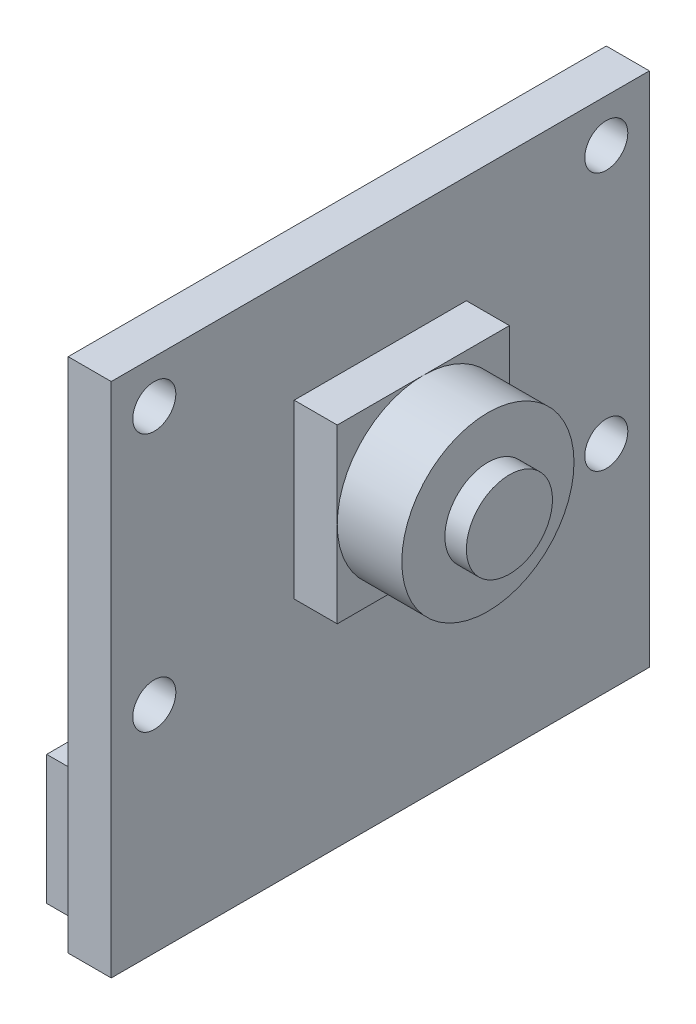
ISO-10303-21;
HEADER;
FILE_DESCRIPTION(('STEP AP214'),'2;1');
FILE_NAME('part.step','',(''),(''),'','','');
FILE_SCHEMA(('AUTOMOTIVE_DESIGN { 1 0 10303 214 1 1 1 1 }'));
ENDSEC;
DATA;
#1=APPLICATION_CONTEXT('core data for automotive mechanical design processes');
#2=APPLICATION_PROTOCOL_DEFINITION('international standard','automotive_design',2000,#1);
#3=PRODUCT_CONTEXT('',#1,'mechanical');
#4=PRODUCT('Part','Part','',(#3));
#5=PRODUCT_RELATED_PRODUCT_CATEGORY('part','',(#4));
#6=PRODUCT_DEFINITION_FORMATION('','',#4);
#7=PRODUCT_DEFINITION_CONTEXT('part definition',#1,'design');
#8=PRODUCT_DEFINITION('design','',#6,#7);
#9=PRODUCT_DEFINITION_SHAPE('','',#8);
#10=(LENGTH_UNIT() NAMED_UNIT(*) SI_UNIT(.MILLI.,.METRE.));
#11=(NAMED_UNIT(*) PLANE_ANGLE_UNIT() SI_UNIT($,.RADIAN.));
#12=(NAMED_UNIT(*) SI_UNIT($,.STERADIAN.) SOLID_ANGLE_UNIT());
#13=UNCERTAINTY_MEASURE_WITH_UNIT(LENGTH_MEASURE(1.E-05),#10,'distance_accuracy_value','');
#14=(GEOMETRIC_REPRESENTATION_CONTEXT(3) GLOBAL_UNCERTAINTY_ASSIGNED_CONTEXT((#13)) GLOBAL_UNIT_ASSIGNED_CONTEXT((#10,
#11,#12)) REPRESENTATION_CONTEXT('',''));
#15=CARTESIAN_POINT('',(0.,0.,0.));
#16=DIRECTION('',(0.,0.,1.));
#17=DIRECTION('',(1.,0.,0.));
#18=AXIS2_PLACEMENT_3D('',#15,#16,#17);
#19=CARTESIAN_POINT('',(4.,0.,0.));
#20=DIRECTION('',(1.,0.,0.));
#21=DIRECTION('',(0.,0.,-1.));
#22=AXIS2_PLACEMENT_3D('',#19,#20,#21);
#23=PLANE('',#22);
#24=CARTESIAN_POINT('',(4.,3.,0.));
#25=DIRECTION('',(1.,0.,0.));
#26=DIRECTION('',(0.,0.,-1.));
#27=AXIS2_PLACEMENT_3D('',#24,#25,#26);
#28=CIRCLE('',#27,4.);
#29=CARTESIAN_POINT('',(4.,3.,-4.));
#30=VERTEX_POINT('',#29);
#31=CARTESIAN_POINT('',(4.,7.,0.));
#32=VERTEX_POINT('',#31);
#33=EDGE_CURVE('E182',#30,#32,#28,.T.);
#34=ORIENTED_EDGE('',*,*,#33,.F.);
#35=DIRECTION('',(0.,1.,0.));
#36=VECTOR('',#35,1.);
#37=CARTESIAN_POINT('',(4.,7.,-4.));
#38=LINE('',#37,#36);
#39=CARTESIAN_POINT('',(4.,7.,-4.));
#40=VERTEX_POINT('',#39);
#41=EDGE_CURVE('E201',#30,#40,#38,.T.);
#42=ORIENTED_EDGE('',*,*,#41,.T.);
#43=DIRECTION('',(0.,0.,1.));
#44=VECTOR('',#43,1.);
#45=CARTESIAN_POINT('',(4.,7.,4.));
#46=LINE('',#45,#44);
#47=EDGE_CURVE('E202',#40,#32,#46,.T.);
#48=ORIENTED_EDGE('',*,*,#47,.T.);
#49=EDGE_LOOP('',(#34,#42,#48));
#50=FACE_BOUND('',#49,.T.);
#51=ADVANCED_FACE('F45',(#50),#23,.T.);
#52=CARTESIAN_POINT('',(4.,3.,4.));
#53=VERTEX_POINT('',#52);
#54=EDGE_CURVE('E190',#32,#53,#28,.T.);
#55=ORIENTED_EDGE('',*,*,#54,.F.);
#56=CARTESIAN_POINT('',(4.,7.,4.));
#57=VERTEX_POINT('',#56);
#58=EDGE_CURVE('E200',#32,#57,#46,.T.);
#59=ORIENTED_EDGE('',*,*,#58,.T.);
#60=DIRECTION('',(0.,-1.,0.));
#61=VECTOR('',#60,1.);
#62=CARTESIAN_POINT('',(4.,7.,4.));
#63=LINE('',#62,#61);
#64=EDGE_CURVE('E206',#57,#53,#63,.T.);
#65=ORIENTED_EDGE('',*,*,#64,.T.);
#66=EDGE_LOOP('',(#55,#59,#65));
#67=FACE_BOUND('',#66,.T.);
#68=ADVANCED_FACE('F303',(#67),#23,.T.);
#69=CARTESIAN_POINT('',(4.,-0.999999999999999,0.));
#70=VERTEX_POINT('',#69);
#71=EDGE_CURVE('E295',#53,#70,#28,.T.);
#72=ORIENTED_EDGE('',*,*,#71,.F.);
#73=CARTESIAN_POINT('',(4.,-0.999999999999999,4.));
#74=VERTEX_POINT('',#73);
#75=EDGE_CURVE('E205',#53,#74,#63,.T.);
#76=ORIENTED_EDGE('',*,*,#75,.T.);
#77=DIRECTION('',(0.,0.,-1.));
#78=VECTOR('',#77,1.);
#79=CARTESIAN_POINT('',(4.,-0.999999999999999,4.));
#80=LINE('',#79,#78);
#81=EDGE_CURVE('E210',#74,#70,#80,.T.);
#82=ORIENTED_EDGE('',*,*,#81,.T.);
#83=EDGE_LOOP('',(#72,#76,#82));
#84=FACE_BOUND('',#83,.T.);
#85=ADVANCED_FACE('F322',(#84),#23,.T.);
#86=CARTESIAN_POINT('',(2.,0.,0.));
#87=DIRECTION('',(-1.,0.,0.));
#88=DIRECTION('',(0.,0.,1.));
#89=AXIS2_PLACEMENT_3D('',#86,#87,#88);
#90=PLANE('',#89);
#91=CARTESIAN_POINT('',(2.,-2.,10.5));
#92=DIRECTION('',(1.,0.,0.));
#93=DIRECTION('',(0.,0.,1.));
#94=AXIS2_PLACEMENT_3D('',#91,#92,#93);
#95=CIRCLE('',#94,1.);
#96=CARTESIAN_POINT('',(2.,-2.,11.5));
#97=VERTEX_POINT('',#96);
#98=EDGE_CURVE('E237',#97,#97,#95,.T.);
#99=ORIENTED_EDGE('',*,*,#98,.F.);
#100=EDGE_LOOP('',(#99));
#101=FACE_BOUND('',#100,.T.);
#102=CARTESIAN_POINT('',(2.,10.,10.5));
#103=DIRECTION('',(1.,0.,0.));
#104=DIRECTION('',(0.,0.,1.));
#105=AXIS2_PLACEMENT_3D('',#102,#103,#104);
#106=CIRCLE('',#105,0.999999999999999);
#107=CARTESIAN_POINT('',(2.,10.,11.5));
#108=VERTEX_POINT('',#107);
#109=EDGE_CURVE('E243',#108,#108,#106,.T.);
#110=ORIENTED_EDGE('',*,*,#109,.F.);
#111=EDGE_LOOP('',(#110));
#112=FACE_BOUND('',#111,.T.);
#113=CARTESIAN_POINT('',(2.,-2.,-10.5));
#114=DIRECTION('',(1.,0.,0.));
#115=DIRECTION('',(0.,0.,-1.));
#116=AXIS2_PLACEMENT_3D('',#113,#114,#115);
#117=CIRCLE('',#116,1.);
#118=CARTESIAN_POINT('',(2.,-2.,-11.5));
#119=VERTEX_POINT('',#118);
#120=EDGE_CURVE('E249',#119,#119,#117,.T.);
#121=ORIENTED_EDGE('',*,*,#120,.F.);
#122=EDGE_LOOP('',(#121));
#123=FACE_BOUND('',#122,.T.);
#124=CARTESIAN_POINT('',(2.,10.,-10.5));
#125=DIRECTION('',(1.,0.,0.));
#126=DIRECTION('',(0.,0.,-1.));
#127=AXIS2_PLACEMENT_3D('',#124,#125,#126);
#128=CIRCLE('',#127,0.999999999999999);
#129=CARTESIAN_POINT('',(2.,10.,-11.5));
#130=VERTEX_POINT('',#129);
#131=EDGE_CURVE('E255',#130,#130,#128,.T.);
#132=ORIENTED_EDGE('',*,*,#131,.F.);
#133=EDGE_LOOP('',(#132));
#134=FACE_BOUND('',#133,.T.);
#135=DIRECTION('',(0.,1.,0.));
#136=VECTOR('',#135,1.);
#137=CARTESIAN_POINT('',(2.,-12.,-12.5));
#138=LINE('',#137,#136);
#139=CARTESIAN_POINT('',(2.,-12.,-12.5));
#140=VERTEX_POINT('',#139);
#141=CARTESIAN_POINT('',(2.,12.,-12.5));
#142=VERTEX_POINT('',#141);
#143=EDGE_CURVE('E261',#140,#142,#138,.T.);
#144=ORIENTED_EDGE('',*,*,#143,.T.);
#145=DIRECTION('',(0.,0.,1.));
#146=VECTOR('',#145,1.);
#147=CARTESIAN_POINT('',(2.,12.,12.5));
#148=LINE('',#147,#146);
#149=CARTESIAN_POINT('',(2.,12.,12.5));
#150=VERTEX_POINT('',#149);
#151=EDGE_CURVE('E264',#142,#150,#148,.T.);
#152=ORIENTED_EDGE('',*,*,#151,.T.);
#153=DIRECTION('',(0.,-1.,0.));
#154=VECTOR('',#153,1.);
#155=CARTESIAN_POINT('',(2.,-12.,12.5));
#156=LINE('',#155,#154);
#157=CARTESIAN_POINT('',(2.,-12.,12.5));
#158=VERTEX_POINT('',#157);
#159=EDGE_CURVE('E267',#150,#158,#156,.T.);
#160=ORIENTED_EDGE('',*,*,#159,.T.);
#161=DIRECTION('',(0.,0.,-1.));
#162=VECTOR('',#161,1.);
#163=CARTESIAN_POINT('',(2.,-12.,12.5));
#164=LINE('',#163,#162);
#165=EDGE_CURVE('E269',#158,#140,#164,.T.);
#166=ORIENTED_EDGE('',*,*,#165,.T.);
#167=EDGE_LOOP('',(#144,#152,#160,#166));
#168=FACE_BOUND('',#167,.T.);
#169=DIRECTION('',(0.,1.,0.));
#170=VECTOR('',#169,1.);
#171=CARTESIAN_POINT('',(2.,7.,-4.));
#172=LINE('',#171,#170);
#173=CARTESIAN_POINT('',(2.,-0.999999999999999,-4.));
#174=VERTEX_POINT('',#173);
#175=CARTESIAN_POINT('',(2.,7.,-4.));
#176=VERTEX_POINT('',#175);
#177=EDGE_CURVE('E194',#174,#176,#172,.T.);
#178=ORIENTED_EDGE('',*,*,#177,.F.);
#179=DIRECTION('',(0.,0.,-1.));
#180=VECTOR('',#179,1.);
#181=CARTESIAN_POINT('',(2.,-0.999999999999999,4.));
#182=LINE('',#181,#180);
#183=CARTESIAN_POINT('',(2.,-0.999999999999999,4.));
#184=VERTEX_POINT('',#183);
#185=EDGE_CURVE('E222',#184,#174,#182,.T.);
#186=ORIENTED_EDGE('',*,*,#185,.F.);
#187=DIRECTION('',(0.,-1.,0.));
#188=VECTOR('',#187,1.);
#189=CARTESIAN_POINT('',(2.,7.,4.));
#190=LINE('',#189,#188);
#191=CARTESIAN_POINT('',(2.,7.,4.));
#192=VERTEX_POINT('',#191);
#193=EDGE_CURVE('E219',#192,#184,#190,.T.);
#194=ORIENTED_EDGE('',*,*,#193,.F.);
#195=DIRECTION('',(0.,0.,1.));
#196=VECTOR('',#195,1.);
#197=CARTESIAN_POINT('',(2.,7.,4.));
#198=LINE('',#197,#196);
#199=EDGE_CURVE('E216',#176,#192,#198,.T.);
#200=ORIENTED_EDGE('',*,*,#199,.F.);
#201=EDGE_LOOP('',(#178,#186,#194,#200));
#202=FACE_BOUND('',#201,.T.);
#203=ADVANCED_FACE('F341',(#101,#112,#123,#134,#168,#202),#90,.F.);
#204=CARTESIAN_POINT('',(0.,0.,0.));
#205=DIRECTION('',(-1.,0.,0.));
#206=DIRECTION('',(0.,0.,1.));
#207=AXIS2_PLACEMENT_3D('',#204,#205,#206);
#208=PLANE('',#207);
#209=DIRECTION('',(0.,-1.,0.));
#210=VECTOR('',#209,1.);
#211=CARTESIAN_POINT('',(0.,-6.5,-10.5));
#212=LINE('',#211,#210);
#213=CARTESIAN_POINT('',(0.,-6.5,-10.5));
#214=VERTEX_POINT('',#213);
#215=CARTESIAN_POINT('',(0.,-12.,-10.5));
#216=VERTEX_POINT('',#215);
#217=EDGE_CURVE('E63',#214,#216,#212,.T.);
#218=ORIENTED_EDGE('',*,*,#217,.F.);
#219=DIRECTION('',(0.,0.,-1.));
#220=VECTOR('',#219,1.);
#221=CARTESIAN_POINT('',(0.,-6.5,-10.5));
#222=LINE('',#221,#220);
#223=CARTESIAN_POINT('',(0.,-6.5,10.5));
#224=VERTEX_POINT('',#223);
#225=EDGE_CURVE('E173',#224,#214,#222,.T.);
#226=ORIENTED_EDGE('',*,*,#225,.F.);
#227=DIRECTION('',(0.,1.,0.));
#228=VECTOR('',#227,1.);
#229=CARTESIAN_POINT('',(0.,-6.5,10.5));
#230=LINE('',#229,#228);
#231=CARTESIAN_POINT('',(0.,-12.,10.5));
#232=VERTEX_POINT('',#231);
#233=EDGE_CURVE('E11',#232,#224,#230,.T.);
#234=ORIENTED_EDGE('',*,*,#233,.F.);
#235=DIRECTION('',(0.,0.,-1.));
#236=VECTOR('',#235,1.);
#237=CARTESIAN_POINT('',(0.,-12.,12.5));
#238=LINE('',#237,#236);
#239=CARTESIAN_POINT('',(0.,-12.,12.5));
#240=VERTEX_POINT('',#239);
#241=EDGE_CURVE('E265',#240,#232,#238,.T.);
#242=ORIENTED_EDGE('',*,*,#241,.F.);
#243=DIRECTION('',(0.,-1.,0.));
#244=VECTOR('',#243,1.);
#245=CARTESIAN_POINT('',(0.,-12.,12.5));
#246=LINE('',#245,#244);
#247=CARTESIAN_POINT('',(0.,12.,12.5));
#248=VERTEX_POINT('',#247);
#249=EDGE_CURVE('E276',#248,#240,#246,.T.);
#250=ORIENTED_EDGE('',*,*,#249,.F.);
#251=DIRECTION('',(0.,0.,1.));
#252=VECTOR('',#251,1.);
#253=CARTESIAN_POINT('',(0.,12.,12.5));
#254=LINE('',#253,#252);
#255=CARTESIAN_POINT('',(0.,12.,-12.5));
#256=VERTEX_POINT('',#255);
#257=EDGE_CURVE('E274',#256,#248,#254,.T.);
#258=ORIENTED_EDGE('',*,*,#257,.F.);
#259=DIRECTION('',(0.,1.,0.));
#260=VECTOR('',#259,1.);
#261=CARTESIAN_POINT('',(0.,-12.,-12.5));
#262=LINE('',#261,#260);
#263=CARTESIAN_POINT('',(0.,-12.,-12.5));
#264=VERTEX_POINT('',#263);
#265=EDGE_CURVE('E258',#264,#256,#262,.T.);
#266=ORIENTED_EDGE('',*,*,#265,.F.);
#267=EDGE_CURVE('E68',#216,#264,#238,.T.);
#268=ORIENTED_EDGE('',*,*,#267,.F.);
#269=EDGE_LOOP('',(#218,#226,#234,#242,#250,#258,#266,#268));
#270=FACE_BOUND('',#269,.T.);
#271=CARTESIAN_POINT('',(0.,10.,10.5));
#272=DIRECTION('',(1.,0.,0.));
#273=DIRECTION('',(0.,0.,1.));
#274=AXIS2_PLACEMENT_3D('',#271,#272,#273);
#275=CIRCLE('',#274,0.999999999999999);
#276=CARTESIAN_POINT('',(0.,10.,11.5));
#277=VERTEX_POINT('',#276);
#278=EDGE_CURVE('E240',#277,#277,#275,.T.);
#279=ORIENTED_EDGE('',*,*,#278,.T.);
#280=EDGE_LOOP('',(#279));
#281=FACE_BOUND('',#280,.T.);
#282=CARTESIAN_POINT('',(0.,10.,-10.5));
#283=DIRECTION('',(1.,0.,0.));
#284=DIRECTION('',(0.,0.,-1.));
#285=AXIS2_PLACEMENT_3D('',#282,#283,#284);
#286=CIRCLE('',#285,0.999999999999999);
#287=CARTESIAN_POINT('',(0.,10.,-11.5));
#288=VERTEX_POINT('',#287);
#289=EDGE_CURVE('E252',#288,#288,#286,.T.);
#290=ORIENTED_EDGE('',*,*,#289,.T.);
#291=EDGE_LOOP('',(#290));
#292=FACE_BOUND('',#291,.T.);
#293=CARTESIAN_POINT('',(0.,-2.,-10.5));
#294=DIRECTION('',(1.,0.,0.));
#295=DIRECTION('',(0.,0.,-1.));
#296=AXIS2_PLACEMENT_3D('',#293,#294,#295);
#297=CIRCLE('',#296,1.);
#298=CARTESIAN_POINT('',(0.,-2.,-11.5));
#299=VERTEX_POINT('',#298);
#300=EDGE_CURVE('E246',#299,#299,#297,.T.);
#301=ORIENTED_EDGE('',*,*,#300,.T.);
#302=EDGE_LOOP('',(#301));
#303=FACE_BOUND('',#302,.T.);
#304=CARTESIAN_POINT('',(0.,-2.,10.5));
#305=DIRECTION('',(1.,0.,0.));
#306=DIRECTION('',(0.,0.,1.));
#307=AXIS2_PLACEMENT_3D('',#304,#305,#306);
#308=CIRCLE('',#307,1.);
#309=CARTESIAN_POINT('',(0.,-2.,11.5));
#310=VERTEX_POINT('',#309);
#311=EDGE_CURVE('E236',#310,#310,#308,.T.);
#312=ORIENTED_EDGE('',*,*,#311,.T.);
#313=EDGE_LOOP('',(#312));
#314=FACE_BOUND('',#313,.T.);
#315=ADVANCED_FACE('F346',(#270,#281,#292,#303,#314),#208,.T.);
#316=CARTESIAN_POINT('',(2.,-12.,-12.5));
#317=DIRECTION('',(0.,0.,1.));
#318=DIRECTION('',(1.,0.,0.));
#319=AXIS2_PLACEMENT_3D('',#316,#317,#318);
#320=PLANE('',#319);
#321=ORIENTED_EDGE('',*,*,#265,.T.);
#322=DIRECTION('',(-1.,0.,0.));
#323=VECTOR('',#322,1.);
#324=CARTESIAN_POINT('',(2.,12.,-12.5));
#325=LINE('',#324,#323);
#326=EDGE_CURVE('E49',#142,#256,#325,.T.);
#327=ORIENTED_EDGE('',*,*,#326,.F.);
#328=ORIENTED_EDGE('',*,*,#143,.F.);
#329=DIRECTION('',(-1.,0.,0.));
#330=VECTOR('',#329,1.);
#331=CARTESIAN_POINT('',(2.,-12.,-12.5));
#332=LINE('',#331,#330);
#333=EDGE_CURVE('E271',#140,#264,#332,.T.);
#334=ORIENTED_EDGE('',*,*,#333,.T.);
#335=EDGE_LOOP('',(#321,#327,#328,#334));
#336=FACE_BOUND('',#335,.T.);
#337=ADVANCED_FACE('F47',(#336),#320,.F.);
#338=CARTESIAN_POINT('',(2.,12.,12.5));
#339=DIRECTION('',(0.,-1.,0.));
#340=DIRECTION('',(0.,0.,-1.));
#341=AXIS2_PLACEMENT_3D('',#338,#339,#340);
#342=PLANE('',#341);
#343=ORIENTED_EDGE('',*,*,#257,.T.);
#344=DIRECTION('',(-1.,0.,0.));
#345=VECTOR('',#344,1.);
#346=CARTESIAN_POINT('',(2.,12.,12.5));
#347=LINE('',#346,#345);
#348=EDGE_CURVE('E285',#150,#248,#347,.T.);
#349=ORIENTED_EDGE('',*,*,#348,.F.);
#350=ORIENTED_EDGE('',*,*,#151,.F.);
#351=ORIENTED_EDGE('',*,*,#326,.T.);
#352=EDGE_LOOP('',(#343,#349,#350,#351));
#353=FACE_BOUND('',#352,.T.);
#354=ADVANCED_FACE('F456',(#353),#342,.F.);
#355=CARTESIAN_POINT('',(2.,-12.,12.5));
#356=DIRECTION('',(0.,0.,-1.));
#357=DIRECTION('',(-1.,0.,0.));
#358=AXIS2_PLACEMENT_3D('',#355,#356,#357);
#359=PLANE('',#358);
#360=ORIENTED_EDGE('',*,*,#249,.T.);
#361=DIRECTION('',(-1.,0.,0.));
#362=VECTOR('',#361,1.);
#363=CARTESIAN_POINT('',(2.,-12.,12.5));
#364=LINE('',#363,#362);
#365=EDGE_CURVE('E283',#158,#240,#364,.T.);
#366=ORIENTED_EDGE('',*,*,#365,.F.);
#367=ORIENTED_EDGE('',*,*,#159,.F.);
#368=ORIENTED_EDGE('',*,*,#348,.T.);
#369=EDGE_LOOP('',(#360,#366,#367,#368));
#370=FACE_BOUND('',#369,.T.);
#371=ADVANCED_FACE('F466',(#370),#359,.F.);
#372=CARTESIAN_POINT('',(2.,-12.,12.5));
#373=DIRECTION('',(0.,1.,0.));
#374=DIRECTION('',(0.,0.,1.));
#375=AXIS2_PLACEMENT_3D('',#372,#373,#374);
#376=PLANE('',#375);
#377=ORIENTED_EDGE('',*,*,#241,.T.);
#378=EDGE_CURVE('E280',#232,#216,#238,.T.);
#379=ORIENTED_EDGE('',*,*,#378,.T.);
#380=ORIENTED_EDGE('',*,*,#267,.T.);
#381=ORIENTED_EDGE('',*,*,#333,.F.);
#382=ORIENTED_EDGE('',*,*,#165,.F.);
#383=ORIENTED_EDGE('',*,*,#365,.T.);
#384=EDGE_LOOP('',(#377,#379,#380,#381,#382,#383));
#385=FACE_BOUND('',#384,.T.);
#386=ADVANCED_FACE('F475',(#385),#376,.F.);
#387=CARTESIAN_POINT('',(2.,10.,-10.5));
#388=DIRECTION('',(-1.,0.,0.));
#389=DIRECTION('',(0.,0.,1.));
#390=AXIS2_PLACEMENT_3D('',#387,#388,#389);
#391=CYLINDRICAL_SURFACE('',#390,0.999999999999999);
#392=ORIENTED_EDGE('',*,*,#131,.T.);
#393=EDGE_LOOP('',(#392));
#394=FACE_BOUND('',#393,.T.);
#395=ORIENTED_EDGE('',*,*,#289,.F.);
#396=EDGE_LOOP('',(#395));
#397=FACE_BOUND('',#396,.T.);
#398=ADVANCED_FACE('F483',(#394,#397),#391,.F.);
#399=CARTESIAN_POINT('',(2.,-2.,-10.5));
#400=DIRECTION('',(-1.,0.,0.));
#401=DIRECTION('',(0.,0.,1.));
#402=AXIS2_PLACEMENT_3D('',#399,#400,#401);
#403=CYLINDRICAL_SURFACE('',#402,1.);
#404=ORIENTED_EDGE('',*,*,#120,.T.);
#405=EDGE_LOOP('',(#404));
#406=FACE_BOUND('',#405,.T.);
#407=ORIENTED_EDGE('',*,*,#300,.F.);
#408=EDGE_LOOP('',(#407));
#409=FACE_BOUND('',#408,.T.);
#410=ADVANCED_FACE('F492',(#406,#409),#403,.F.);
#411=CARTESIAN_POINT('',(2.,10.,10.5));
#412=DIRECTION('',(-1.,0.,0.));
#413=DIRECTION('',(0.,0.,1.));
#414=AXIS2_PLACEMENT_3D('',#411,#412,#413);
#415=CYLINDRICAL_SURFACE('',#414,0.999999999999999);
#416=ORIENTED_EDGE('',*,*,#109,.T.);
#417=EDGE_LOOP('',(#416));
#418=FACE_BOUND('',#417,.T.);
#419=ORIENTED_EDGE('',*,*,#278,.F.);
#420=EDGE_LOOP('',(#419));
#421=FACE_BOUND('',#420,.T.);
#422=ADVANCED_FACE('F502',(#418,#421),#415,.F.);
#423=CARTESIAN_POINT('',(2.,-2.,10.5));
#424=DIRECTION('',(-1.,0.,0.));
#425=DIRECTION('',(0.,0.,1.));
#426=AXIS2_PLACEMENT_3D('',#423,#424,#425);
#427=CYLINDRICAL_SURFACE('',#426,1.);
#428=ORIENTED_EDGE('',*,*,#98,.T.);
#429=EDGE_LOOP('',(#428));
#430=FACE_BOUND('',#429,.T.);
#431=ORIENTED_EDGE('',*,*,#311,.F.);
#432=EDGE_LOOP('',(#431));
#433=FACE_BOUND('',#432,.T.);
#434=ADVANCED_FACE('F512',(#430,#433),#427,.F.);
#435=CARTESIAN_POINT('',(4.,7.,-4.));
#436=DIRECTION('',(0.,0.,1.));
#437=DIRECTION('',(0.,-1.,0.));
#438=AXIS2_PLACEMENT_3D('',#435,#436,#437);
#439=PLANE('',#438);
#440=ORIENTED_EDGE('',*,*,#177,.T.);
#441=DIRECTION('',(-1.,0.,0.));
#442=VECTOR('',#441,1.);
#443=CARTESIAN_POINT('',(4.,7.,-4.));
#444=LINE('',#443,#442);
#445=EDGE_CURVE('E233',#40,#176,#444,.T.);
#446=ORIENTED_EDGE('',*,*,#445,.F.);
#447=ORIENTED_EDGE('',*,*,#41,.F.);
#448=CARTESIAN_POINT('',(4.,-0.999999999999999,-4.));
#449=VERTEX_POINT('',#448);
#450=EDGE_CURVE('E198',#449,#30,#38,.T.);
#451=ORIENTED_EDGE('',*,*,#450,.F.);
#452=DIRECTION('',(-1.,0.,0.));
#453=VECTOR('',#452,1.);
#454=CARTESIAN_POINT('',(4.,-0.999999999999999,-4.));
#455=LINE('',#454,#453);
#456=EDGE_CURVE('E213',#449,#174,#455,.T.);
#457=ORIENTED_EDGE('',*,*,#456,.T.);
#458=EDGE_LOOP('',(#440,#446,#447,#451,#457));
#459=FACE_BOUND('',#458,.T.);
#460=ADVANCED_FACE('F314',(#459),#439,.F.);
#461=CARTESIAN_POINT('',(4.,7.,4.));
#462=DIRECTION('',(0.,-1.,0.));
#463=DIRECTION('',(0.,0.,-1.));
#464=AXIS2_PLACEMENT_3D('',#461,#462,#463);
#465=PLANE('',#464);
#466=ORIENTED_EDGE('',*,*,#199,.T.);
#467=DIRECTION('',(-1.,0.,0.));
#468=VECTOR('',#467,1.);
#469=CARTESIAN_POINT('',(4.,7.,4.));
#470=LINE('',#469,#468);
#471=EDGE_CURVE('E230',#57,#192,#470,.T.);
#472=ORIENTED_EDGE('',*,*,#471,.F.);
#473=ORIENTED_EDGE('',*,*,#58,.F.);
#474=ORIENTED_EDGE('',*,*,#47,.F.);
#475=ORIENTED_EDGE('',*,*,#445,.T.);
#476=EDGE_LOOP('',(#466,#472,#473,#474,#475));
#477=FACE_BOUND('',#476,.T.);
#478=ADVANCED_FACE('F308',(#477),#465,.F.);
#479=CARTESIAN_POINT('',(4.,7.,4.));
#480=DIRECTION('',(0.,0.,-1.));
#481=DIRECTION('',(0.,1.,0.));
#482=AXIS2_PLACEMENT_3D('',#479,#480,#481);
#483=PLANE('',#482);
#484=ORIENTED_EDGE('',*,*,#193,.T.);
#485=DIRECTION('',(-1.,0.,0.));
#486=VECTOR('',#485,1.);
#487=CARTESIAN_POINT('',(4.,-0.999999999999999,4.));
#488=LINE('',#487,#486);
#489=EDGE_CURVE('E227',#74,#184,#488,.T.);
#490=ORIENTED_EDGE('',*,*,#489,.F.);
#491=ORIENTED_EDGE('',*,*,#75,.F.);
#492=ORIENTED_EDGE('',*,*,#64,.F.);
#493=ORIENTED_EDGE('',*,*,#471,.T.);
#494=EDGE_LOOP('',(#484,#490,#491,#492,#493));
#495=FACE_BOUND('',#494,.T.);
#496=ADVANCED_FACE('F317',(#495),#483,.F.);
#497=CARTESIAN_POINT('',(4.,-0.999999999999999,4.));
#498=DIRECTION('',(0.,1.,0.));
#499=DIRECTION('',(0.,0.,1.));
#500=AXIS2_PLACEMENT_3D('',#497,#498,#499);
#501=PLANE('',#500);
#502=ORIENTED_EDGE('',*,*,#185,.T.);
#503=ORIENTED_EDGE('',*,*,#456,.F.);
#504=EDGE_CURVE('E209',#70,#449,#80,.T.);
#505=ORIENTED_EDGE('',*,*,#504,.F.);
#506=ORIENTED_EDGE('',*,*,#81,.F.);
#507=ORIENTED_EDGE('',*,*,#489,.T.);
#508=EDGE_LOOP('',(#502,#503,#505,#506,#507));
#509=FACE_BOUND('',#508,.T.);
#510=ADVANCED_FACE('F325',(#509),#501,.F.);
#511=EDGE_CURVE('E197',#70,#30,#28,.T.);
#512=ORIENTED_EDGE('',*,*,#511,.F.);
#513=ORIENTED_EDGE('',*,*,#504,.T.);
#514=ORIENTED_EDGE('',*,*,#450,.T.);
#515=EDGE_LOOP('',(#512,#513,#514));
#516=FACE_BOUND('',#515,.T.);
#517=ADVANCED_FACE('F328',(#516),#23,.T.);
#518=CARTESIAN_POINT('',(7.,3.,0.));
#519=DIRECTION('',(-1.,0.,0.));
#520=DIRECTION('',(0.,0.,1.));
#521=AXIS2_PLACEMENT_3D('',#518,#519,#520);
#522=CYLINDRICAL_SURFACE('',#521,4.);
#523=CARTESIAN_POINT('',(7.,3.,0.));
#524=DIRECTION('',(1.,0.,0.));
#525=DIRECTION('',(0.,0.,-1.));
#526=AXIS2_PLACEMENT_3D('',#523,#524,#525);
#527=CIRCLE('',#526,4.);
#528=CARTESIAN_POINT('',(7.,3.,-4.));
#529=VERTEX_POINT('',#528);
#530=EDGE_CURVE('E191',#529,#529,#527,.T.);
#531=ORIENTED_EDGE('',*,*,#530,.F.);
#532=EDGE_LOOP('',(#531));
#533=FACE_BOUND('',#532,.T.);
#534=ORIENTED_EDGE('',*,*,#33,.T.);
#535=ORIENTED_EDGE('',*,*,#54,.T.);
#536=ORIENTED_EDGE('',*,*,#71,.T.);
#537=ORIENTED_EDGE('',*,*,#511,.T.);
#538=EDGE_LOOP('',(#534,#535,#536,#537));
#539=FACE_BOUND('',#538,.T.);
#540=ADVANCED_FACE('F299',(#533,#539),#522,.T.);
#541=CARTESIAN_POINT('',(7.,3.,0.));
#542=DIRECTION('',(1.,0.,0.));
#543=DIRECTION('',(0.,0.,-1.));
#544=AXIS2_PLACEMENT_3D('',#541,#542,#543);
#545=PLANE('',#544);
#546=CARTESIAN_POINT('',(7.,3.,0.));
#547=DIRECTION('',(1.,0.,0.));
#548=DIRECTION('',(0.,0.,-1.));
#549=AXIS2_PLACEMENT_3D('',#546,#547,#548);
#550=CIRCLE('',#549,2.);
#551=CARTESIAN_POINT('',(7.,3.,-2.));
#552=VERTEX_POINT('',#551);
#553=EDGE_CURVE('E54',#552,#552,#550,.T.);
#554=ORIENTED_EDGE('',*,*,#553,.F.);
#555=EDGE_LOOP('',(#554));
#556=FACE_BOUND('',#555,.T.);
#557=ORIENTED_EDGE('',*,*,#530,.T.);
#558=EDGE_LOOP('',(#557));
#559=FACE_BOUND('',#558,.T.);
#560=ADVANCED_FACE('F335',(#556,#559),#545,.T.);
#561=CARTESIAN_POINT('',(8.,3.,0.));
#562=DIRECTION('',(-1.,0.,0.));
#563=DIRECTION('',(0.,0.,1.));
#564=AXIS2_PLACEMENT_3D('',#561,#562,#563);
#565=CYLINDRICAL_SURFACE('',#564,2.);
#566=CARTESIAN_POINT('',(8.,3.,0.));
#567=DIRECTION('',(1.,0.,0.));
#568=DIRECTION('',(0.,0.,-1.));
#569=AXIS2_PLACEMENT_3D('',#566,#567,#568);
#570=CIRCLE('',#569,2.);
#571=CARTESIAN_POINT('',(8.,3.,-2.));
#572=VERTEX_POINT('',#571);
#573=EDGE_CURVE('E179',#572,#572,#570,.T.);
#574=ORIENTED_EDGE('',*,*,#573,.F.);
#575=EDGE_LOOP('',(#574));
#576=FACE_BOUND('',#575,.T.);
#577=ORIENTED_EDGE('',*,*,#553,.T.);
#578=EDGE_LOOP('',(#577));
#579=FACE_BOUND('',#578,.T.);
#580=ADVANCED_FACE('F397',(#576,#579),#565,.T.);
#581=CARTESIAN_POINT('',(8.,3.,0.));
#582=DIRECTION('',(1.,0.,0.));
#583=DIRECTION('',(0.,0.,-1.));
#584=AXIS2_PLACEMENT_3D('',#581,#582,#583);
#585=PLANE('',#584);
#586=ORIENTED_EDGE('',*,*,#573,.T.);
#587=EDGE_LOOP('',(#586));
#588=FACE_BOUND('',#587,.T.);
#589=ADVANCED_FACE('F403',(#588),#585,.T.);
#590=CARTESIAN_POINT('',(-3.,-6.5,-10.5));
#591=DIRECTION('',(0.,0.,1.));
#592=DIRECTION('',(1.,0.,0.));
#593=AXIS2_PLACEMENT_3D('',#590,#591,#592);
#594=PLANE('',#593);
#595=ORIENTED_EDGE('',*,*,#217,.T.);
#596=CARTESIAN_POINT('',(0.,-12.5,-10.5));
#597=VERTEX_POINT('',#596);
#598=EDGE_CURVE('E177',#216,#597,#212,.T.);
#599=ORIENTED_EDGE('',*,*,#598,.T.);
#600=DIRECTION('',(1.,0.,0.));
#601=VECTOR('',#600,1.);
#602=CARTESIAN_POINT('',(-3.,-12.5,-10.5));
#603=LINE('',#602,#601);
#604=CARTESIAN_POINT('',(-3.,-12.5,-10.5));
#605=VERTEX_POINT('',#604);
#606=EDGE_CURVE('E158',#605,#597,#603,.T.);
#607=ORIENTED_EDGE('',*,*,#606,.F.);
#608=DIRECTION('',(0.,-1.,0.));
#609=VECTOR('',#608,1.);
#610=CARTESIAN_POINT('',(-3.,-6.5,-10.5));
#611=LINE('',#610,#609);
#612=CARTESIAN_POINT('',(-3.,-6.5,-10.5));
#613=VERTEX_POINT('',#612);
#614=EDGE_CURVE('E164',#613,#605,#611,.T.);
#615=ORIENTED_EDGE('',*,*,#614,.F.);
#616=DIRECTION('',(1.,0.,0.));
#617=VECTOR('',#616,1.);
#618=CARTESIAN_POINT('',(-3.,-6.5,-10.5));
#619=LINE('',#618,#617);
#620=EDGE_CURVE('E718',#613,#214,#619,.T.);
#621=ORIENTED_EDGE('',*,*,#620,.T.);
#622=EDGE_LOOP('',(#595,#599,#607,#615,#621));
#623=FACE_BOUND('',#622,.T.);
#624=ADVANCED_FACE('F175',(#623),#594,.F.);
#625=CARTESIAN_POINT('',(-3.,-12.5,-10.5));
#626=DIRECTION('',(0.,1.,0.));
#627=DIRECTION('',(0.,0.,1.));
#628=AXIS2_PLACEMENT_3D('',#625,#626,#627);
#629=PLANE('',#628);
#630=DIRECTION('',(0.,0.,1.));
#631=VECTOR('',#630,1.);
#632=CARTESIAN_POINT('',(0.,-12.5,-10.5));
#633=LINE('',#632,#631);
#634=CARTESIAN_POINT('',(0.,-12.5,10.5));
#635=VERTEX_POINT('',#634);
#636=EDGE_CURVE('E713',#597,#635,#633,.T.);
#637=ORIENTED_EDGE('',*,*,#636,.T.);
#638=DIRECTION('',(1.,0.,0.));
#639=VECTOR('',#638,1.);
#640=CARTESIAN_POINT('',(-3.,-12.5,10.5));
#641=LINE('',#640,#639);
#642=CARTESIAN_POINT('',(-3.,-12.5,10.5));
#643=VERTEX_POINT('',#642);
#644=EDGE_CURVE('E160',#643,#635,#641,.T.);
#645=ORIENTED_EDGE('',*,*,#644,.F.);
#646=DIRECTION('',(0.,0.,1.));
#647=VECTOR('',#646,1.);
#648=CARTESIAN_POINT('',(-3.,-12.5,-10.5));
#649=LINE('',#648,#647);
#650=EDGE_CURVE('E154',#605,#643,#649,.T.);
#651=ORIENTED_EDGE('',*,*,#650,.F.);
#652=ORIENTED_EDGE('',*,*,#606,.T.);
#653=EDGE_LOOP('',(#637,#645,#651,#652));
#654=FACE_BOUND('',#653,.T.);
#655=ADVANCED_FACE('F156',(#654),#629,.F.);
#656=CARTESIAN_POINT('',(-3.,-6.5,10.5));
#657=DIRECTION('',(0.,0.,-1.));
#658=DIRECTION('',(-1.,0.,0.));
#659=AXIS2_PLACEMENT_3D('',#656,#657,#658);
#660=PLANE('',#659);
#661=EDGE_CURVE('E56',#635,#232,#230,.T.);
#662=ORIENTED_EDGE('',*,*,#661,.T.);
#663=ORIENTED_EDGE('',*,*,#233,.T.);
#664=DIRECTION('',(1.,0.,0.));
#665=VECTOR('',#664,1.);
#666=CARTESIAN_POINT('',(-3.,-6.5,10.5));
#667=LINE('',#666,#665);
#668=CARTESIAN_POINT('',(-3.,-6.5,10.5));
#669=VERTEX_POINT('',#668);
#670=EDGE_CURVE('E184',#669,#224,#667,.T.);
#671=ORIENTED_EDGE('',*,*,#670,.F.);
#672=DIRECTION('',(0.,1.,0.));
#673=VECTOR('',#672,1.);
#674=CARTESIAN_POINT('',(-3.,-6.5,10.5));
#675=LINE('',#674,#673);
#676=EDGE_CURVE('E163',#643,#669,#675,.T.);
#677=ORIENTED_EDGE('',*,*,#676,.F.);
#678=ORIENTED_EDGE('',*,*,#644,.T.);
#679=EDGE_LOOP('',(#662,#663,#671,#677,#678));
#680=FACE_BOUND('',#679,.T.);
#681=ADVANCED_FACE('F433',(#680),#660,.F.);
#682=CARTESIAN_POINT('',(-3.,-6.5,-10.5));
#683=DIRECTION('',(0.,-1.,0.));
#684=DIRECTION('',(0.,0.,-1.));
#685=AXIS2_PLACEMENT_3D('',#682,#683,#684);
#686=PLANE('',#685);
#687=ORIENTED_EDGE('',*,*,#225,.T.);
#688=ORIENTED_EDGE('',*,*,#620,.F.);
#689=DIRECTION('',(0.,0.,-1.));
#690=VECTOR('',#689,1.);
#691=CARTESIAN_POINT('',(-3.,-6.5,-10.5));
#692=LINE('',#691,#690);
#693=EDGE_CURVE('E169',#669,#613,#692,.T.);
#694=ORIENTED_EDGE('',*,*,#693,.F.);
#695=ORIENTED_EDGE('',*,*,#670,.T.);
#696=EDGE_LOOP('',(#687,#688,#694,#695));
#697=FACE_BOUND('',#696,.T.);
#698=ADVANCED_FACE('F676',(#697),#686,.F.);
#699=CARTESIAN_POINT('',(-3.,0.,0.));
#700=DIRECTION('',(-1.,0.,0.));
#701=DIRECTION('',(0.,0.,1.));
#702=AXIS2_PLACEMENT_3D('',#699,#700,#701);
#703=PLANE('',#702);
#704=ORIENTED_EDGE('',*,*,#614,.T.);
#705=ORIENTED_EDGE('',*,*,#650,.T.);
#706=ORIENTED_EDGE('',*,*,#676,.T.);
#707=ORIENTED_EDGE('',*,*,#693,.T.);
#708=EDGE_LOOP('',(#704,#705,#706,#707));
#709=FACE_BOUND('',#708,.T.);
#710=ADVANCED_FACE('F167',(#709),#703,.T.);
#711=CARTESIAN_POINT('',(0.,0.,0.));
#712=DIRECTION('',(-1.,0.,0.));
#713=DIRECTION('',(0.,0.,1.));
#714=AXIS2_PLACEMENT_3D('',#711,#712,#713);
#715=PLANE('',#714);
#716=ORIENTED_EDGE('',*,*,#378,.F.);
#717=ORIENTED_EDGE('',*,*,#661,.F.);
#718=ORIENTED_EDGE('',*,*,#636,.F.);
#719=ORIENTED_EDGE('',*,*,#598,.F.);
#720=EDGE_LOOP('',(#716,#717,#718,#719));
#721=FACE_BOUND('',#720,.T.);
#722=ADVANCED_FACE('F693',(#721),#715,.F.);
#723=CLOSED_SHELL('',(#51,#68,#85,#203,#315,#337,#354,#371,#386,#398,#410,#422,#434,#460,#478,
#496,#510,#517,#540,#560,#580,#589,#624,#655,#681,#698,#710,#722));
#724=MANIFOLD_SOLID_BREP('B2',#723);
#725=ADVANCED_BREP_SHAPE_REPRESENTATION('',(#18,#724),#14);
#726=SHAPE_DEFINITION_REPRESENTATION(#9,#725);
ENDSEC;
END-ISO-10303-21;
